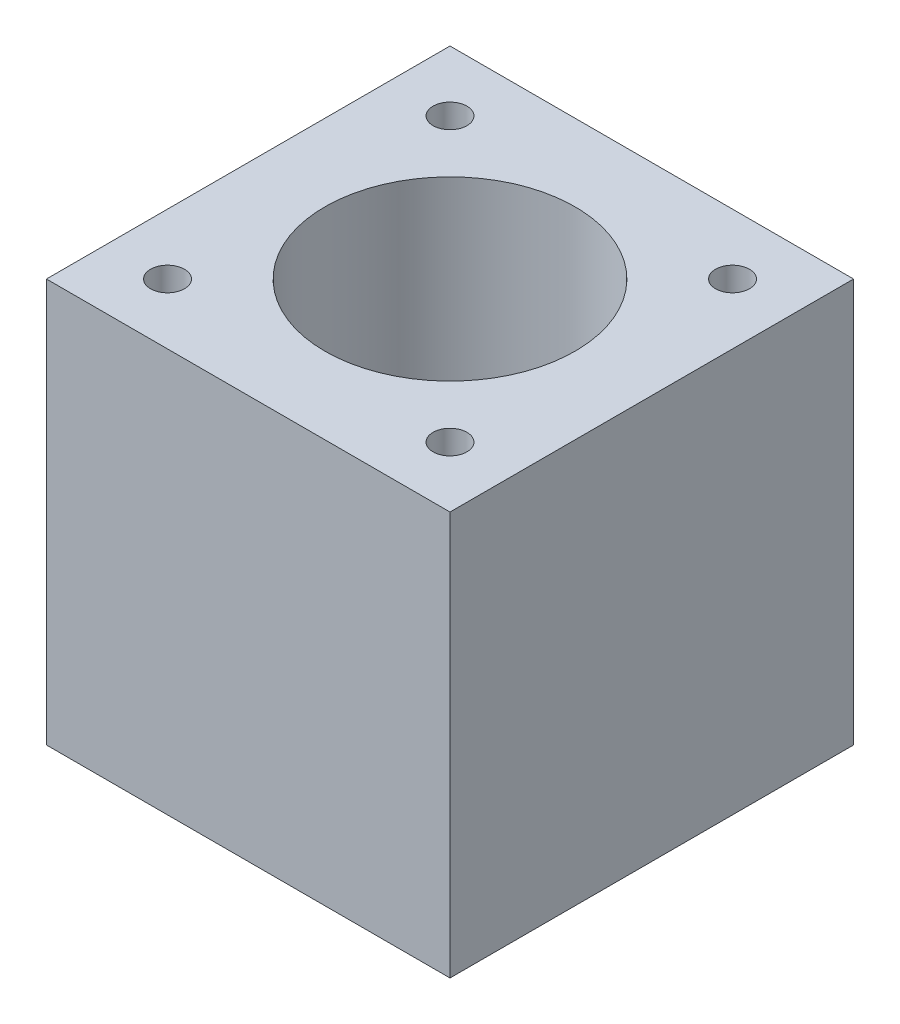
ISO-10303-21;
HEADER;
FILE_DESCRIPTION(('STEP AP214'),'2;1');
FILE_NAME('part.step','',(''),(''),'','','');
FILE_SCHEMA(('AUTOMOTIVE_DESIGN { 1 0 10303 214 1 1 1 1 }'));
ENDSEC;
DATA;
#1=APPLICATION_CONTEXT('core data for automotive mechanical design processes');
#2=APPLICATION_PROTOCOL_DEFINITION('international standard','automotive_design',2000,#1);
#3=PRODUCT_CONTEXT('',#1,'mechanical');
#4=PRODUCT('Part','Part','',(#3));
#5=PRODUCT_RELATED_PRODUCT_CATEGORY('part','',(#4));
#6=PRODUCT_DEFINITION_FORMATION('','',#4);
#7=PRODUCT_DEFINITION_CONTEXT('part definition',#1,'design');
#8=PRODUCT_DEFINITION('design','',#6,#7);
#9=PRODUCT_DEFINITION_SHAPE('','',#8);
#10=(LENGTH_UNIT() NAMED_UNIT(*) SI_UNIT(.MILLI.,.METRE.));
#11=(NAMED_UNIT(*) PLANE_ANGLE_UNIT() SI_UNIT($,.RADIAN.));
#12=(NAMED_UNIT(*) SI_UNIT($,.STERADIAN.) SOLID_ANGLE_UNIT());
#13=UNCERTAINTY_MEASURE_WITH_UNIT(LENGTH_MEASURE(1.E-05),#10,'distance_accuracy_value','');
#14=(GEOMETRIC_REPRESENTATION_CONTEXT(3) GLOBAL_UNCERTAINTY_ASSIGNED_CONTEXT((#13)) GLOBAL_UNIT_ASSIGNED_CONTEXT((#10,
#11,#12)) REPRESENTATION_CONTEXT('',''));
#15=CARTESIAN_POINT('',(0.,0.,0.));
#16=DIRECTION('',(0.,0.,1.));
#17=DIRECTION('',(1.,0.,0.));
#18=AXIS2_PLACEMENT_3D('',#15,#16,#17);
#19=CARTESIAN_POINT('',(0.,0.,50.));
#20=DIRECTION('',(1.,0.,0.));
#21=DIRECTION('',(0.,1.,0.));
#22=AXIS2_PLACEMENT_3D('',#19,#20,#21);
#23=PLANE('',#22);
#24=DIRECTION('',(0.,-1.,0.));
#25=VECTOR('',#24,1.);
#26=CARTESIAN_POINT('',(0.,0.,0.));
#27=LINE('',#26,#25);
#28=CARTESIAN_POINT('',(0.,50.,0.));
#29=VERTEX_POINT('',#28);
#30=CARTESIAN_POINT('',(0.,0.,0.));
#31=VERTEX_POINT('',#30);
#32=EDGE_CURVE('E97',#29,#31,#27,.T.);
#33=ORIENTED_EDGE('',*,*,#32,.T.);
#34=DIRECTION('',(0.,0.,-1.));
#35=VECTOR('',#34,1.);
#36=CARTESIAN_POINT('',(0.,0.,50.));
#37=LINE('',#36,#35);
#38=CARTESIAN_POINT('',(0.,0.,50.));
#39=VERTEX_POINT('',#38);
#40=EDGE_CURVE('E11',#39,#31,#37,.T.);
#41=ORIENTED_EDGE('',*,*,#40,.F.);
#42=DIRECTION('',(0.,-1.,0.));
#43=VECTOR('',#42,1.);
#44=CARTESIAN_POINT('',(0.,0.,50.));
#45=LINE('',#44,#43);
#46=CARTESIAN_POINT('',(0.,50.,50.));
#47=VERTEX_POINT('',#46);
#48=EDGE_CURVE('E85',#47,#39,#45,.T.);
#49=ORIENTED_EDGE('',*,*,#48,.F.);
#50=DIRECTION('',(0.,0.,-1.));
#51=VECTOR('',#50,1.);
#52=CARTESIAN_POINT('',(0.,50.,50.));
#53=LINE('',#52,#51);
#54=EDGE_CURVE('E93',#47,#29,#53,.T.);
#55=ORIENTED_EDGE('',*,*,#54,.T.);
#56=EDGE_LOOP('',(#33,#41,#49,#55));
#57=FACE_BOUND('',#56,.T.);
#58=ADVANCED_FACE('F34',(#57),#23,.F.);
#59=CARTESIAN_POINT('',(0.,0.,50.));
#60=DIRECTION('',(0.,1.,0.));
#61=DIRECTION('',(0.,0.,1.));
#62=AXIS2_PLACEMENT_3D('',#59,#60,#61);
#63=PLANE('',#62);
#64=CARTESIAN_POINT('',(25.,0.,25.));
#65=DIRECTION('',(0.,1.,0.));
#66=DIRECTION('',(0.,0.,1.));
#67=AXIS2_PLACEMENT_3D('',#64,#65,#66);
#68=CIRCLE('',#67,15.5);
#69=CARTESIAN_POINT('',(25.,0.,40.5));
#70=VERTEX_POINT('',#69);
#71=EDGE_CURVE('E124',#70,#70,#68,.F.);
#72=ORIENTED_EDGE('',*,*,#71,.F.);
#73=EDGE_LOOP('',(#72));
#74=FACE_BOUND('',#73,.T.);
#75=CARTESIAN_POINT('',(7.49999999999999,0.,42.5));
#76=DIRECTION('',(0.,1.,0.));
#77=DIRECTION('',(0.,0.,1.));
#78=AXIS2_PLACEMENT_3D('',#75,#76,#77);
#79=CIRCLE('',#78,2.1);
#80=CARTESIAN_POINT('',(7.49999999999999,0.,44.6));
#81=VERTEX_POINT('',#80);
#82=EDGE_CURVE('E117',#81,#81,#79,.F.);
#83=ORIENTED_EDGE('',*,*,#82,.F.);
#84=EDGE_LOOP('',(#83));
#85=FACE_BOUND('',#84,.T.);
#86=CARTESIAN_POINT('',(42.5,0.,42.5));
#87=DIRECTION('',(0.,1.,0.));
#88=DIRECTION('',(0.,0.,1.));
#89=AXIS2_PLACEMENT_3D('',#86,#87,#88);
#90=CIRCLE('',#89,2.1);
#91=CARTESIAN_POINT('',(42.5,0.,44.6));
#92=VERTEX_POINT('',#91);
#93=EDGE_CURVE('E125',#92,#92,#90,.F.);
#94=ORIENTED_EDGE('',*,*,#93,.F.);
#95=EDGE_LOOP('',(#94));
#96=FACE_BOUND('',#95,.T.);
#97=CARTESIAN_POINT('',(42.5,0.,7.5));
#98=DIRECTION('',(0.,1.,0.));
#99=DIRECTION('',(0.,0.,1.));
#100=AXIS2_PLACEMENT_3D('',#97,#98,#99);
#101=CIRCLE('',#100,2.1);
#102=CARTESIAN_POINT('',(42.5,0.,9.6));
#103=VERTEX_POINT('',#102);
#104=EDGE_CURVE('E116',#103,#103,#101,.F.);
#105=ORIENTED_EDGE('',*,*,#104,.F.);
#106=EDGE_LOOP('',(#105));
#107=FACE_BOUND('',#106,.T.);
#108=CARTESIAN_POINT('',(7.49999999999998,0.,7.5));
#109=DIRECTION('',(0.,1.,0.));
#110=DIRECTION('',(0.,0.,1.));
#111=AXIS2_PLACEMENT_3D('',#108,#109,#110);
#112=CIRCLE('',#111,2.1);
#113=CARTESIAN_POINT('',(7.49999999999998,0.,9.6));
#114=VERTEX_POINT('',#113);
#115=EDGE_CURVE('E100',#114,#114,#112,.F.);
#116=ORIENTED_EDGE('',*,*,#115,.F.);
#117=EDGE_LOOP('',(#116));
#118=FACE_BOUND('',#117,.T.);
#119=DIRECTION('',(1.,0.,0.));
#120=VECTOR('',#119,1.);
#121=CARTESIAN_POINT('',(0.,0.,0.));
#122=LINE('',#121,#120);
#123=CARTESIAN_POINT('',(50.,0.,0.));
#124=VERTEX_POINT('',#123);
#125=EDGE_CURVE('E89',#31,#124,#122,.T.);
#126=ORIENTED_EDGE('',*,*,#125,.T.);
#127=DIRECTION('',(0.,0.,-1.));
#128=VECTOR('',#127,1.);
#129=CARTESIAN_POINT('',(50.,0.,50.));
#130=LINE('',#129,#128);
#131=CARTESIAN_POINT('',(50.,0.,50.));
#132=VERTEX_POINT('',#131);
#133=EDGE_CURVE('E42',#132,#124,#130,.T.);
#134=ORIENTED_EDGE('',*,*,#133,.F.);
#135=DIRECTION('',(1.,0.,0.));
#136=VECTOR('',#135,1.);
#137=CARTESIAN_POINT('',(0.,0.,50.));
#138=LINE('',#137,#136);
#139=EDGE_CURVE('E80',#39,#132,#138,.T.);
#140=ORIENTED_EDGE('',*,*,#139,.F.);
#141=ORIENTED_EDGE('',*,*,#40,.T.);
#142=EDGE_LOOP('',(#126,#134,#140,#141));
#143=FACE_BOUND('',#142,.T.);
#144=ADVANCED_FACE('F88',(#74,#85,#96,#107,#118,#143),#63,.F.);
#145=CARTESIAN_POINT('',(50.,0.,50.));
#146=DIRECTION('',(-1.,0.,0.));
#147=DIRECTION('',(0.,-1.,0.));
#148=AXIS2_PLACEMENT_3D('',#145,#146,#147);
#149=PLANE('',#148);
#150=DIRECTION('',(0.,1.,0.));
#151=VECTOR('',#150,1.);
#152=CARTESIAN_POINT('',(50.,0.,0.));
#153=LINE('',#152,#151);
#154=CARTESIAN_POINT('',(50.,50.,0.));
#155=VERTEX_POINT('',#154);
#156=EDGE_CURVE('E67',#124,#155,#153,.T.);
#157=ORIENTED_EDGE('',*,*,#156,.T.);
#158=DIRECTION('',(0.,0.,-1.));
#159=VECTOR('',#158,1.);
#160=CARTESIAN_POINT('',(50.,50.,50.));
#161=LINE('',#160,#159);
#162=CARTESIAN_POINT('',(50.,50.,50.));
#163=VERTEX_POINT('',#162);
#164=EDGE_CURVE('E90',#163,#155,#161,.T.);
#165=ORIENTED_EDGE('',*,*,#164,.F.);
#166=DIRECTION('',(0.,1.,0.));
#167=VECTOR('',#166,1.);
#168=CARTESIAN_POINT('',(50.,0.,50.));
#169=LINE('',#168,#167);
#170=EDGE_CURVE('E83',#132,#163,#169,.T.);
#171=ORIENTED_EDGE('',*,*,#170,.F.);
#172=ORIENTED_EDGE('',*,*,#133,.T.);
#173=EDGE_LOOP('',(#157,#165,#171,#172));
#174=FACE_BOUND('',#173,.T.);
#175=ADVANCED_FACE('F91',(#174),#149,.F.);
#176=CARTESIAN_POINT('',(0.,50.,50.));
#177=DIRECTION('',(0.,-1.,0.));
#178=DIRECTION('',(0.,0.,-1.));
#179=AXIS2_PLACEMENT_3D('',#176,#177,#178);
#180=PLANE('',#179);
#181=CARTESIAN_POINT('',(25.,50.,25.));
#182=DIRECTION('',(0.,1.,0.));
#183=DIRECTION('',(0.,0.,1.));
#184=AXIS2_PLACEMENT_3D('',#181,#182,#183);
#185=CIRCLE('',#184,15.5);
#186=CARTESIAN_POINT('',(25.,50.,40.5));
#187=VERTEX_POINT('',#186);
#188=EDGE_CURVE('E137',#187,#187,#185,.T.);
#189=ORIENTED_EDGE('',*,*,#188,.F.);
#190=EDGE_LOOP('',(#189));
#191=FACE_BOUND('',#190,.T.);
#192=CARTESIAN_POINT('',(7.49999999999999,50.,42.5));
#193=DIRECTION('',(0.,1.,0.));
#194=DIRECTION('',(0.,0.,1.));
#195=AXIS2_PLACEMENT_3D('',#192,#193,#194);
#196=CIRCLE('',#195,2.1);
#197=CARTESIAN_POINT('',(7.49999999999999,50.,44.6));
#198=VERTEX_POINT('',#197);
#199=EDGE_CURVE('E121',#198,#198,#196,.T.);
#200=ORIENTED_EDGE('',*,*,#199,.F.);
#201=EDGE_LOOP('',(#200));
#202=FACE_BOUND('',#201,.T.);
#203=CARTESIAN_POINT('',(42.5,50.,42.5));
#204=DIRECTION('',(0.,1.,0.));
#205=DIRECTION('',(0.,0.,1.));
#206=AXIS2_PLACEMENT_3D('',#203,#204,#205);
#207=CIRCLE('',#206,2.1);
#208=CARTESIAN_POINT('',(42.5,50.,44.6));
#209=VERTEX_POINT('',#208);
#210=EDGE_CURVE('E120',#209,#209,#207,.T.);
#211=ORIENTED_EDGE('',*,*,#210,.F.);
#212=EDGE_LOOP('',(#211));
#213=FACE_BOUND('',#212,.T.);
#214=CARTESIAN_POINT('',(42.5,50.,7.5));
#215=DIRECTION('',(0.,1.,0.));
#216=DIRECTION('',(0.,0.,1.));
#217=AXIS2_PLACEMENT_3D('',#214,#215,#216);
#218=CIRCLE('',#217,2.1);
#219=CARTESIAN_POINT('',(42.5,50.,9.6));
#220=VERTEX_POINT('',#219);
#221=EDGE_CURVE('E128',#220,#220,#218,.T.);
#222=ORIENTED_EDGE('',*,*,#221,.F.);
#223=EDGE_LOOP('',(#222));
#224=FACE_BOUND('',#223,.T.);
#225=CARTESIAN_POINT('',(7.49999999999998,50.,7.5));
#226=DIRECTION('',(0.,1.,0.));
#227=DIRECTION('',(0.,0.,1.));
#228=AXIS2_PLACEMENT_3D('',#225,#226,#227);
#229=CIRCLE('',#228,2.1);
#230=CARTESIAN_POINT('',(7.49999999999998,50.,9.6));
#231=VERTEX_POINT('',#230);
#232=EDGE_CURVE('E113',#231,#231,#229,.T.);
#233=ORIENTED_EDGE('',*,*,#232,.F.);
#234=EDGE_LOOP('',(#233));
#235=FACE_BOUND('',#234,.T.);
#236=DIRECTION('',(-1.,0.,0.));
#237=VECTOR('',#236,1.);
#238=CARTESIAN_POINT('',(0.,50.,0.));
#239=LINE('',#238,#237);
#240=EDGE_CURVE('E73',#155,#29,#239,.T.);
#241=ORIENTED_EDGE('',*,*,#240,.T.);
#242=ORIENTED_EDGE('',*,*,#54,.F.);
#243=DIRECTION('',(-1.,0.,0.));
#244=VECTOR('',#243,1.);
#245=CARTESIAN_POINT('',(0.,50.,50.));
#246=LINE('',#245,#244);
#247=EDGE_CURVE('E50',#163,#47,#246,.T.);
#248=ORIENTED_EDGE('',*,*,#247,.F.);
#249=ORIENTED_EDGE('',*,*,#164,.T.);
#250=EDGE_LOOP('',(#241,#242,#248,#249));
#251=FACE_BOUND('',#250,.T.);
#252=ADVANCED_FACE('F105',(#191,#202,#213,#224,#235,#251),#180,.F.);
#253=CARTESIAN_POINT('',(0.,0.,50.));
#254=DIRECTION('',(0.,0.,-1.));
#255=DIRECTION('',(-1.,0.,0.));
#256=AXIS2_PLACEMENT_3D('',#253,#254,#255);
#257=PLANE('',#256);
#258=ORIENTED_EDGE('',*,*,#48,.T.);
#259=ORIENTED_EDGE('',*,*,#139,.T.);
#260=ORIENTED_EDGE('',*,*,#170,.T.);
#261=ORIENTED_EDGE('',*,*,#247,.T.);
#262=EDGE_LOOP('',(#258,#259,#260,#261));
#263=FACE_BOUND('',#262,.T.);
#264=ADVANCED_FACE('F81',(#263),#257,.F.);
#265=CARTESIAN_POINT('',(0.,0.,0.));
#266=DIRECTION('',(0.,0.,-1.));
#267=DIRECTION('',(-1.,0.,0.));
#268=AXIS2_PLACEMENT_3D('',#265,#266,#267);
#269=PLANE('',#268);
#270=ORIENTED_EDGE('',*,*,#32,.F.);
#271=ORIENTED_EDGE('',*,*,#240,.F.);
#272=ORIENTED_EDGE('',*,*,#156,.F.);
#273=ORIENTED_EDGE('',*,*,#125,.F.);
#274=EDGE_LOOP('',(#270,#271,#272,#273));
#275=FACE_BOUND('',#274,.T.);
#276=ADVANCED_FACE('F108',(#275),#269,.T.);
#277=CARTESIAN_POINT('',(7.49999999999998,-0.001000000000001,7.5));
#278=DIRECTION('',(0.,1.,0.));
#279=DIRECTION('',(0.,0.,1.));
#280=AXIS2_PLACEMENT_3D('',#277,#278,#279);
#281=CYLINDRICAL_SURFACE('',#280,2.1);
#282=ORIENTED_EDGE('',*,*,#232,.T.);
#283=EDGE_LOOP('',(#282));
#284=FACE_BOUND('',#283,.T.);
#285=ORIENTED_EDGE('',*,*,#115,.T.);
#286=EDGE_LOOP('',(#285));
#287=FACE_BOUND('',#286,.T.);
#288=ADVANCED_FACE('F155',(#284,#287),#281,.F.);
#289=CARTESIAN_POINT('',(42.5,-0.001000000000001,7.5));
#290=DIRECTION('',(0.,1.,0.));
#291=DIRECTION('',(0.,0.,1.));
#292=AXIS2_PLACEMENT_3D('',#289,#290,#291);
#293=CYLINDRICAL_SURFACE('',#292,2.1);
#294=ORIENTED_EDGE('',*,*,#221,.T.);
#295=EDGE_LOOP('',(#294));
#296=FACE_BOUND('',#295,.T.);
#297=ORIENTED_EDGE('',*,*,#104,.T.);
#298=EDGE_LOOP('',(#297));
#299=FACE_BOUND('',#298,.T.);
#300=ADVANCED_FACE('F158',(#296,#299),#293,.F.);
#301=CARTESIAN_POINT('',(42.5,-0.001000000000001,42.5));
#302=DIRECTION('',(0.,1.,0.));
#303=DIRECTION('',(0.,0.,1.));
#304=AXIS2_PLACEMENT_3D('',#301,#302,#303);
#305=CYLINDRICAL_SURFACE('',#304,2.1);
#306=ORIENTED_EDGE('',*,*,#210,.T.);
#307=EDGE_LOOP('',(#306));
#308=FACE_BOUND('',#307,.T.);
#309=ORIENTED_EDGE('',*,*,#93,.T.);
#310=EDGE_LOOP('',(#309));
#311=FACE_BOUND('',#310,.T.);
#312=ADVANCED_FACE('F179',(#308,#311),#305,.F.);
#313=CARTESIAN_POINT('',(7.49999999999999,-0.001000000000001,42.5));
#314=DIRECTION('',(0.,1.,0.));
#315=DIRECTION('',(0.,0.,1.));
#316=AXIS2_PLACEMENT_3D('',#313,#314,#315);
#317=CYLINDRICAL_SURFACE('',#316,2.1);
#318=ORIENTED_EDGE('',*,*,#199,.T.);
#319=EDGE_LOOP('',(#318));
#320=FACE_BOUND('',#319,.T.);
#321=ORIENTED_EDGE('',*,*,#82,.T.);
#322=EDGE_LOOP('',(#321));
#323=FACE_BOUND('',#322,.T.);
#324=ADVANCED_FACE('F176',(#320,#323),#317,.F.);
#325=CARTESIAN_POINT('',(25.,-0.001000000000001,25.));
#326=DIRECTION('',(0.,1.,0.));
#327=DIRECTION('',(0.,0.,1.));
#328=AXIS2_PLACEMENT_3D('',#325,#326,#327);
#329=CYLINDRICAL_SURFACE('',#328,15.5);
#330=ORIENTED_EDGE('',*,*,#188,.T.);
#331=EDGE_LOOP('',(#330));
#332=FACE_BOUND('',#331,.T.);
#333=ORIENTED_EDGE('',*,*,#71,.T.);
#334=EDGE_LOOP('',(#333));
#335=FACE_BOUND('',#334,.T.);
#336=ADVANCED_FACE('F141',(#332,#335),#329,.F.);
#337=CLOSED_SHELL('',(#58,#144,#175,#252,#264,#276,#288,#300,#312,#324,#336));
#338=MANIFOLD_SOLID_BREP('B2',#337);
#339=ADVANCED_BREP_SHAPE_REPRESENTATION('',(#18,#338),#14);
#340=SHAPE_DEFINITION_REPRESENTATION(#9,#339);
ENDSEC;
END-ISO-10303-21;
